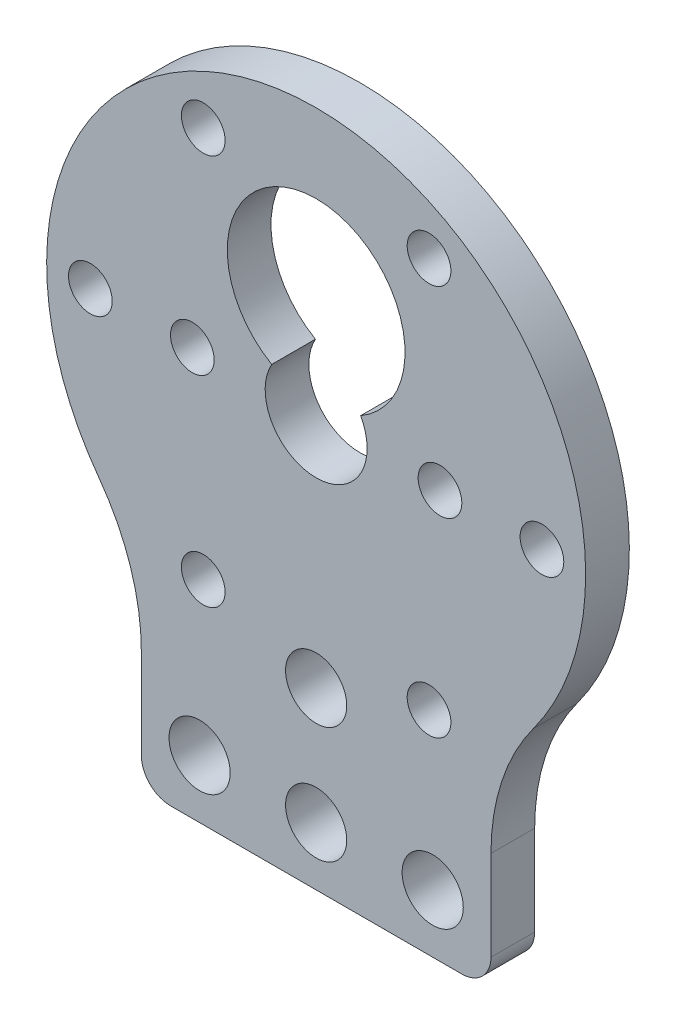
ISO-10303-21;
HEADER;
FILE_DESCRIPTION(('STEP AP214'),'2;1');
FILE_NAME('part.step','',(''),(''),'','','');
FILE_SCHEMA(('AUTOMOTIVE_DESIGN { 1 0 10303 214 1 1 1 1 }'));
ENDSEC;
DATA;
#1=APPLICATION_CONTEXT('core data for automotive mechanical design processes');
#2=APPLICATION_PROTOCOL_DEFINITION('international standard','automotive_design',2000,#1);
#3=PRODUCT_CONTEXT('',#1,'mechanical');
#4=PRODUCT('Part','Part','',(#3));
#5=PRODUCT_RELATED_PRODUCT_CATEGORY('part','',(#4));
#6=PRODUCT_DEFINITION_FORMATION('','',#4);
#7=PRODUCT_DEFINITION_CONTEXT('part definition',#1,'design');
#8=PRODUCT_DEFINITION('design','',#6,#7);
#9=PRODUCT_DEFINITION_SHAPE('','',#8);
#10=(LENGTH_UNIT() NAMED_UNIT(*) SI_UNIT(.MILLI.,.METRE.));
#11=(NAMED_UNIT(*) PLANE_ANGLE_UNIT() SI_UNIT($,.RADIAN.));
#12=(NAMED_UNIT(*) SI_UNIT($,.STERADIAN.) SOLID_ANGLE_UNIT());
#13=UNCERTAINTY_MEASURE_WITH_UNIT(LENGTH_MEASURE(1.E-05),#10,'distance_accuracy_value','');
#14=(GEOMETRIC_REPRESENTATION_CONTEXT(3) GLOBAL_UNCERTAINTY_ASSIGNED_CONTEXT((#13)) GLOBAL_UNIT_ASSIGNED_CONTEXT((#10,
#11,#12)) REPRESENTATION_CONTEXT('',''));
#15=CARTESIAN_POINT('',(0.,0.,0.));
#16=DIRECTION('',(0.,0.,1.));
#17=DIRECTION('',(1.,0.,0.));
#18=AXIS2_PLACEMENT_3D('',#15,#16,#17);
#19=CARTESIAN_POINT('',(0.,0.,3.));
#20=DIRECTION('',(0.,0.,1.));
#21=DIRECTION('',(1.,0.,0.));
#22=AXIS2_PLACEMENT_3D('',#19,#20,#21);
#23=PLANE('',#22);
#24=CARTESIAN_POINT('',(8.5,0.,3.));
#25=DIRECTION('',(0.,0.,1.));
#26=DIRECTION('',(1.,0.,0.));
#27=AXIS2_PLACEMENT_3D('',#24,#25,#26);
#28=CIRCLE('',#27,1.5);
#29=CARTESIAN_POINT('',(10.,0.,3.));
#30=VERTEX_POINT('',#29);
#31=EDGE_CURVE('E456',#30,#30,#28,.T.);
#32=ORIENTED_EDGE('',*,*,#31,.F.);
#33=EDGE_LOOP('',(#32));
#34=FACE_BOUND('',#33,.T.);
#35=CARTESIAN_POINT('',(-8.5,0.,3.));
#36=DIRECTION('',(0.,0.,1.));
#37=DIRECTION('',(1.,0.,0.));
#38=AXIS2_PLACEMENT_3D('',#35,#36,#37);
#39=CIRCLE('',#38,1.5);
#40=CARTESIAN_POINT('',(-7.,0.,3.));
#41=VERTEX_POINT('',#40);
#42=EDGE_CURVE('E450',#41,#41,#39,.T.);
#43=ORIENTED_EDGE('',*,*,#42,.F.);
#44=EDGE_LOOP('',(#43));
#45=FACE_BOUND('',#44,.T.);
#46=CARTESIAN_POINT('',(0.,-16.,3.));
#47=DIRECTION('',(0.,0.,1.));
#48=DIRECTION('',(1.,0.,0.));
#49=AXIS2_PLACEMENT_3D('',#46,#47,#48);
#50=CIRCLE('',#49,2.1);
#51=CARTESIAN_POINT('',(2.1,-16.,3.));
#52=VERTEX_POINT('',#51);
#53=EDGE_CURVE('E453',#52,#52,#50,.T.);
#54=ORIENTED_EDGE('',*,*,#53,.F.);
#55=EDGE_LOOP('',(#54));
#56=FACE_BOUND('',#55,.T.);
#57=CARTESIAN_POINT('',(0.,-24.,3.));
#58=DIRECTION('',(0.,0.,1.));
#59=DIRECTION('',(1.,0.,0.));
#60=AXIS2_PLACEMENT_3D('',#57,#58,#59);
#61=CIRCLE('',#60,2.1);
#62=CARTESIAN_POINT('',(2.1,-24.,3.));
#63=VERTEX_POINT('',#62);
#64=EDGE_CURVE('E465',#63,#63,#61,.T.);
#65=ORIENTED_EDGE('',*,*,#64,.F.);
#66=EDGE_LOOP('',(#65));
#67=FACE_BOUND('',#66,.T.);
#68=CARTESIAN_POINT('',(8.,-24.,3.));
#69=DIRECTION('',(0.,0.,1.));
#70=DIRECTION('',(1.,0.,0.));
#71=AXIS2_PLACEMENT_3D('',#68,#69,#70);
#72=CIRCLE('',#71,2.1);
#73=CARTESIAN_POINT('',(10.1,-24.,3.));
#74=VERTEX_POINT('',#73);
#75=EDGE_CURVE('E471',#74,#74,#72,.T.);
#76=ORIENTED_EDGE('',*,*,#75,.F.);
#77=EDGE_LOOP('',(#76));
#78=FACE_BOUND('',#77,.T.);
#79=CARTESIAN_POINT('',(-8.,-24.,3.));
#80=DIRECTION('',(0.,0.,1.));
#81=DIRECTION('',(1.,0.,0.));
#82=AXIS2_PLACEMENT_3D('',#79,#80,#81);
#83=CIRCLE('',#82,2.1);
#84=CARTESIAN_POINT('',(-5.9,-24.,3.));
#85=VERTEX_POINT('',#84);
#86=EDGE_CURVE('E477',#85,#85,#83,.T.);
#87=ORIENTED_EDGE('',*,*,#86,.F.);
#88=EDGE_LOOP('',(#87));
#89=FACE_BOUND('',#88,.T.);
#90=CARTESIAN_POINT('',(7.75000000000016,-13.4233937586587,3.));
#91=DIRECTION('',(0.,0.,1.));
#92=DIRECTION('',(1.,0.,0.));
#93=AXIS2_PLACEMENT_3D('',#90,#91,#92);
#94=CIRCLE('',#93,1.5);
#95=CARTESIAN_POINT('',(9.25000000000016,-13.4233937586587,3.));
#96=VERTEX_POINT('',#95);
#97=EDGE_CURVE('E483',#96,#96,#94,.T.);
#98=ORIENTED_EDGE('',*,*,#97,.F.);
#99=EDGE_LOOP('',(#98));
#100=FACE_BOUND('',#99,.T.);
#101=CARTESIAN_POINT('',(-7.74999999999987,-13.4233937586589,3.));
#102=DIRECTION('',(0.,0.,1.));
#103=DIRECTION('',(1.,0.,0.));
#104=AXIS2_PLACEMENT_3D('',#101,#102,#103);
#105=CIRCLE('',#104,1.5);
#106=CARTESIAN_POINT('',(-6.24999999999988,-13.4233937586589,3.));
#107=VERTEX_POINT('',#106);
#108=EDGE_CURVE('E489',#107,#107,#105,.T.);
#109=ORIENTED_EDGE('',*,*,#108,.F.);
#110=EDGE_LOOP('',(#109));
#111=FACE_BOUND('',#110,.T.);
#112=CARTESIAN_POINT('',(-15.5,0.,3.));
#113=DIRECTION('',(0.,0.,1.));
#114=DIRECTION('',(1.,0.,0.));
#115=AXIS2_PLACEMENT_3D('',#112,#113,#114);
#116=CIRCLE('',#115,1.5);
#117=CARTESIAN_POINT('',(-14.,0.,3.));
#118=VERTEX_POINT('',#117);
#119=EDGE_CURVE('E495',#118,#118,#116,.T.);
#120=ORIENTED_EDGE('',*,*,#119,.F.);
#121=EDGE_LOOP('',(#120));
#122=FACE_BOUND('',#121,.T.);
#123=CARTESIAN_POINT('',(-7.75000000000006,13.4233937586588,3.));
#124=DIRECTION('',(0.,0.,1.));
#125=DIRECTION('',(1.,0.,0.));
#126=AXIS2_PLACEMENT_3D('',#123,#124,#125);
#127=CIRCLE('',#126,1.5);
#128=CARTESIAN_POINT('',(-6.25000000000006,13.4233937586588,3.));
#129=VERTEX_POINT('',#128);
#130=EDGE_CURVE('E501',#129,#129,#127,.T.);
#131=ORIENTED_EDGE('',*,*,#130,.F.);
#132=EDGE_LOOP('',(#131));
#133=FACE_BOUND('',#132,.T.);
#134=CARTESIAN_POINT('',(7.74999999999997,13.4233937586588,3.));
#135=DIRECTION('',(0.,0.,1.));
#136=DIRECTION('',(1.,0.,0.));
#137=AXIS2_PLACEMENT_3D('',#134,#135,#136);
#138=CIRCLE('',#137,1.5);
#139=CARTESIAN_POINT('',(9.24999999999997,13.4233937586588,3.));
#140=VERTEX_POINT('',#139);
#141=EDGE_CURVE('E507',#140,#140,#138,.T.);
#142=ORIENTED_EDGE('',*,*,#141,.F.);
#143=EDGE_LOOP('',(#142));
#144=FACE_BOUND('',#143,.T.);
#145=CARTESIAN_POINT('',(15.5,0.,3.));
#146=DIRECTION('',(0.,0.,1.));
#147=DIRECTION('',(1.,0.,0.));
#148=AXIS2_PLACEMENT_3D('',#145,#146,#147);
#149=CIRCLE('',#148,1.5);
#150=CARTESIAN_POINT('',(17.,0.,3.));
#151=VERTEX_POINT('',#150);
#152=EDGE_CURVE('E512',#151,#151,#149,.T.);
#153=ORIENTED_EDGE('',*,*,#152,.F.);
#154=EDGE_LOOP('',(#153));
#155=FACE_BOUND('',#154,.T.);
#156=DIRECTION('',(1.,0.,0.));
#157=VECTOR('',#156,1.);
#158=CARTESIAN_POINT('',(0.,-28.,3.));
#159=LINE('',#158,#157);
#160=CARTESIAN_POINT('',(-10.,-28.,3.));
#161=VERTEX_POINT('',#160);
#162=CARTESIAN_POINT('',(10.,-28.,3.));
#163=VERTEX_POINT('',#162);
#164=EDGE_CURVE('E140',#161,#163,#159,.T.);
#165=ORIENTED_EDGE('',*,*,#164,.T.);
#166=CARTESIAN_POINT('',(10.,-26.,3.));
#167=DIRECTION('',(0.,0.,1.));
#168=DIRECTION('',(1.,0.,0.));
#169=AXIS2_PLACEMENT_3D('',#166,#167,#168);
#170=CIRCLE('',#169,2.);
#171=CARTESIAN_POINT('',(12.,-26.,3.));
#172=VERTEX_POINT('',#171);
#173=EDGE_CURVE('E42',#163,#172,#170,.T.);
#174=ORIENTED_EDGE('',*,*,#173,.T.);
#175=DIRECTION('',(0.,1.,0.));
#176=VECTOR('',#175,1.);
#177=CARTESIAN_POINT('',(12.,-28.,3.));
#178=LINE('',#177,#176);
#179=CARTESIAN_POINT('',(12.,-19.8305320150519,3.));
#180=VERTEX_POINT('',#179);
#181=EDGE_CURVE('E142',#172,#180,#178,.T.);
#182=ORIENTED_EDGE('',*,*,#181,.T.);
#183=CARTESIAN_POINT('',(27.,-19.8305320150519,3.));
#184=DIRECTION('',(0.,0.,1.));
#185=DIRECTION('',(1.,0.,0.));
#186=AXIS2_PLACEMENT_3D('',#183,#184,#185);
#187=CIRCLE('',#186,15.);
#188=CARTESIAN_POINT('',(14.910447761194,-10.9511893217451,3.));
#189=VERTEX_POINT('',#188);
#190=EDGE_CURVE('E171',#180,#189,#187,.F.);
#191=ORIENTED_EDGE('',*,*,#190,.T.);
#192=CARTESIAN_POINT('',(0.,0.,3.));
#193=DIRECTION('',(0.,0.,1.));
#194=DIRECTION('',(1.,0.,0.));
#195=AXIS2_PLACEMENT_3D('',#192,#193,#194);
#196=CIRCLE('',#195,18.5);
#197=CARTESIAN_POINT('',(-14.910447761194,-10.9511893217451,3.));
#198=VERTEX_POINT('',#197);
#199=EDGE_CURVE('E145',#189,#198,#196,.T.);
#200=ORIENTED_EDGE('',*,*,#199,.T.);
#201=CARTESIAN_POINT('',(-27.,-19.8305320150519,3.));
#202=DIRECTION('',(0.,0.,1.));
#203=DIRECTION('',(1.,0.,0.));
#204=AXIS2_PLACEMENT_3D('',#201,#202,#203);
#205=CIRCLE('',#204,15.);
#206=CARTESIAN_POINT('',(-12.,-19.8305320150519,3.));
#207=VERTEX_POINT('',#206);
#208=EDGE_CURVE('E175',#198,#207,#205,.F.);
#209=ORIENTED_EDGE('',*,*,#208,.T.);
#210=DIRECTION('',(0.,-1.,0.));
#211=VECTOR('',#210,1.);
#212=CARTESIAN_POINT('',(-12.,-28.,3.));
#213=LINE('',#212,#211);
#214=CARTESIAN_POINT('',(-12.,-26.,3.));
#215=VERTEX_POINT('',#214);
#216=EDGE_CURVE('E148',#207,#215,#213,.T.);
#217=ORIENTED_EDGE('',*,*,#216,.T.);
#218=CARTESIAN_POINT('',(-10.,-26.,3.));
#219=DIRECTION('',(0.,0.,1.));
#220=DIRECTION('',(1.,0.,0.));
#221=AXIS2_PLACEMENT_3D('',#218,#219,#220);
#222=CIRCLE('',#221,2.);
#223=EDGE_CURVE('E188',#215,#161,#222,.T.);
#224=ORIENTED_EDGE('',*,*,#223,.T.);
#225=EDGE_LOOP('',(#165,#174,#182,#191,#200,#209,#217,#224));
#226=FACE_BOUND('',#225,.T.);
#227=CARTESIAN_POINT('',(0.,0.,3.));
#228=DIRECTION('',(0.,0.,1.));
#229=DIRECTION('',(1.,0.,0.));
#230=AXIS2_PLACEMENT_3D('',#227,#228,#229);
#231=CIRCLE('',#230,3.5);
#232=CARTESIAN_POINT('',(-3.04982301259651,1.71714285714286,3.));
#233=VERTEX_POINT('',#232);
#234=CARTESIAN_POINT('',(3.04982301259651,1.71714285714286,3.));
#235=VERTEX_POINT('',#234);
#236=EDGE_CURVE('E113',#233,#235,#231,.T.);
#237=ORIENTED_EDGE('',*,*,#236,.F.);
#238=CARTESIAN_POINT('',(0.,7.,3.));
#239=DIRECTION('',(0.,0.,1.));
#240=DIRECTION('',(1.,0.,0.));
#241=AXIS2_PLACEMENT_3D('',#238,#239,#240);
#242=CIRCLE('',#241,6.1);
#243=EDGE_CURVE('E123',#235,#233,#242,.T.);
#244=ORIENTED_EDGE('',*,*,#243,.F.);
#245=EDGE_LOOP('',(#237,#244));
#246=FACE_BOUND('',#245,.T.);
#247=ADVANCED_FACE('F34',(#34,#45,#56,#67,#78,#89,#100,#111,#122,#133,#144,#155,#226,#246),#23,.T.);
#248=CARTESIAN_POINT('',(0.,0.,0.));
#249=DIRECTION('',(0.,0.,1.));
#250=DIRECTION('',(1.,0.,0.));
#251=AXIS2_PLACEMENT_3D('',#248,#249,#250);
#252=PLANE('',#251);
#253=CARTESIAN_POINT('',(8.5,0.,0.));
#254=DIRECTION('',(0.,0.,1.));
#255=DIRECTION('',(1.,0.,0.));
#256=AXIS2_PLACEMENT_3D('',#253,#254,#255);
#257=CIRCLE('',#256,1.5);
#258=CARTESIAN_POINT('',(10.,0.,0.));
#259=VERTEX_POINT('',#258);
#260=EDGE_CURVE('E451',#259,#259,#257,.T.);
#261=ORIENTED_EDGE('',*,*,#260,.T.);
#262=EDGE_LOOP('',(#261));
#263=FACE_BOUND('',#262,.T.);
#264=CARTESIAN_POINT('',(-8.5,0.,0.));
#265=DIRECTION('',(0.,0.,1.));
#266=DIRECTION('',(1.,0.,0.));
#267=AXIS2_PLACEMENT_3D('',#264,#265,#266);
#268=CIRCLE('',#267,1.5);
#269=CARTESIAN_POINT('',(-7.,0.,0.));
#270=VERTEX_POINT('',#269);
#271=EDGE_CURVE('E447',#270,#270,#268,.T.);
#272=ORIENTED_EDGE('',*,*,#271,.T.);
#273=EDGE_LOOP('',(#272));
#274=FACE_BOUND('',#273,.T.);
#275=CARTESIAN_POINT('',(0.,-16.,0.));
#276=DIRECTION('',(0.,0.,1.));
#277=DIRECTION('',(1.,0.,0.));
#278=AXIS2_PLACEMENT_3D('',#275,#276,#277);
#279=CIRCLE('',#278,2.1);
#280=CARTESIAN_POINT('',(2.1,-16.,0.));
#281=VERTEX_POINT('',#280);
#282=EDGE_CURVE('E462',#281,#281,#279,.T.);
#283=ORIENTED_EDGE('',*,*,#282,.T.);
#284=EDGE_LOOP('',(#283));
#285=FACE_BOUND('',#284,.T.);
#286=CARTESIAN_POINT('',(0.,-24.,0.));
#287=DIRECTION('',(0.,0.,1.));
#288=DIRECTION('',(1.,0.,0.));
#289=AXIS2_PLACEMENT_3D('',#286,#287,#288);
#290=CIRCLE('',#289,2.1);
#291=CARTESIAN_POINT('',(2.1,-24.,0.));
#292=VERTEX_POINT('',#291);
#293=EDGE_CURVE('E468',#292,#292,#290,.T.);
#294=ORIENTED_EDGE('',*,*,#293,.T.);
#295=EDGE_LOOP('',(#294));
#296=FACE_BOUND('',#295,.T.);
#297=CARTESIAN_POINT('',(8.,-24.,0.));
#298=DIRECTION('',(0.,0.,1.));
#299=DIRECTION('',(1.,0.,0.));
#300=AXIS2_PLACEMENT_3D('',#297,#298,#299);
#301=CIRCLE('',#300,2.1);
#302=CARTESIAN_POINT('',(10.1,-24.,0.));
#303=VERTEX_POINT('',#302);
#304=EDGE_CURVE('E474',#303,#303,#301,.T.);
#305=ORIENTED_EDGE('',*,*,#304,.T.);
#306=EDGE_LOOP('',(#305));
#307=FACE_BOUND('',#306,.T.);
#308=CARTESIAN_POINT('',(-8.,-24.,0.));
#309=DIRECTION('',(0.,0.,1.));
#310=DIRECTION('',(1.,0.,0.));
#311=AXIS2_PLACEMENT_3D('',#308,#309,#310);
#312=CIRCLE('',#311,2.1);
#313=CARTESIAN_POINT('',(-5.9,-24.,0.));
#314=VERTEX_POINT('',#313);
#315=EDGE_CURVE('E480',#314,#314,#312,.T.);
#316=ORIENTED_EDGE('',*,*,#315,.T.);
#317=EDGE_LOOP('',(#316));
#318=FACE_BOUND('',#317,.T.);
#319=CARTESIAN_POINT('',(7.75000000000016,-13.4233937586587,0.));
#320=DIRECTION('',(0.,0.,1.));
#321=DIRECTION('',(1.,0.,0.));
#322=AXIS2_PLACEMENT_3D('',#319,#320,#321);
#323=CIRCLE('',#322,1.5);
#324=CARTESIAN_POINT('',(9.25000000000016,-13.4233937586587,0.));
#325=VERTEX_POINT('',#324);
#326=EDGE_CURVE('E486',#325,#325,#323,.T.);
#327=ORIENTED_EDGE('',*,*,#326,.T.);
#328=EDGE_LOOP('',(#327));
#329=FACE_BOUND('',#328,.T.);
#330=CARTESIAN_POINT('',(-7.74999999999987,-13.4233937586589,0.));
#331=DIRECTION('',(0.,0.,1.));
#332=DIRECTION('',(1.,0.,0.));
#333=AXIS2_PLACEMENT_3D('',#330,#331,#332);
#334=CIRCLE('',#333,1.5);
#335=CARTESIAN_POINT('',(-6.24999999999988,-13.4233937586589,0.));
#336=VERTEX_POINT('',#335);
#337=EDGE_CURVE('E492',#336,#336,#334,.T.);
#338=ORIENTED_EDGE('',*,*,#337,.T.);
#339=EDGE_LOOP('',(#338));
#340=FACE_BOUND('',#339,.T.);
#341=CARTESIAN_POINT('',(-15.5,0.,0.));
#342=DIRECTION('',(0.,0.,1.));
#343=DIRECTION('',(1.,0.,0.));
#344=AXIS2_PLACEMENT_3D('',#341,#342,#343);
#345=CIRCLE('',#344,1.5);
#346=CARTESIAN_POINT('',(-14.,0.,0.));
#347=VERTEX_POINT('',#346);
#348=EDGE_CURVE('E498',#347,#347,#345,.T.);
#349=ORIENTED_EDGE('',*,*,#348,.T.);
#350=EDGE_LOOP('',(#349));
#351=FACE_BOUND('',#350,.T.);
#352=CARTESIAN_POINT('',(-7.75000000000006,13.4233937586588,0.));
#353=DIRECTION('',(0.,0.,1.));
#354=DIRECTION('',(1.,0.,0.));
#355=AXIS2_PLACEMENT_3D('',#352,#353,#354);
#356=CIRCLE('',#355,1.5);
#357=CARTESIAN_POINT('',(-6.25000000000006,13.4233937586588,0.));
#358=VERTEX_POINT('',#357);
#359=EDGE_CURVE('E504',#358,#358,#356,.T.);
#360=ORIENTED_EDGE('',*,*,#359,.T.);
#361=EDGE_LOOP('',(#360));
#362=FACE_BOUND('',#361,.T.);
#363=CARTESIAN_POINT('',(7.74999999999997,13.4233937586588,0.));
#364=DIRECTION('',(0.,0.,1.));
#365=DIRECTION('',(1.,0.,0.));
#366=AXIS2_PLACEMENT_3D('',#363,#364,#365);
#367=CIRCLE('',#366,1.5);
#368=CARTESIAN_POINT('',(9.24999999999997,13.4233937586588,0.));
#369=VERTEX_POINT('',#368);
#370=EDGE_CURVE('E510',#369,#369,#367,.T.);
#371=ORIENTED_EDGE('',*,*,#370,.T.);
#372=EDGE_LOOP('',(#371));
#373=FACE_BOUND('',#372,.T.);
#374=CARTESIAN_POINT('',(15.5,0.,0.));
#375=DIRECTION('',(0.,0.,1.));
#376=DIRECTION('',(1.,0.,0.));
#377=AXIS2_PLACEMENT_3D('',#374,#375,#376);
#378=CIRCLE('',#377,1.5);
#379=CARTESIAN_POINT('',(17.,0.,0.));
#380=VERTEX_POINT('',#379);
#381=EDGE_CURVE('E134',#380,#380,#378,.T.);
#382=ORIENTED_EDGE('',*,*,#381,.T.);
#383=EDGE_LOOP('',(#382));
#384=FACE_BOUND('',#383,.T.);
#385=DIRECTION('',(0.,1.,0.));
#386=VECTOR('',#385,1.);
#387=CARTESIAN_POINT('',(12.,-28.,0.));
#388=LINE('',#387,#386);
#389=CARTESIAN_POINT('',(12.,-26.,0.));
#390=VERTEX_POINT('',#389);
#391=CARTESIAN_POINT('',(12.,-19.8305320150519,0.));
#392=VERTEX_POINT('',#391);
#393=EDGE_CURVE('E152',#390,#392,#388,.T.);
#394=ORIENTED_EDGE('',*,*,#393,.F.);
#395=CARTESIAN_POINT('',(10.,-26.,0.));
#396=DIRECTION('',(0.,0.,1.));
#397=DIRECTION('',(1.,0.,0.));
#398=AXIS2_PLACEMENT_3D('',#395,#396,#397);
#399=CIRCLE('',#398,2.);
#400=CARTESIAN_POINT('',(10.,-28.,0.));
#401=VERTEX_POINT('',#400);
#402=EDGE_CURVE('E182',#390,#401,#399,.F.);
#403=ORIENTED_EDGE('',*,*,#402,.T.);
#404=DIRECTION('',(1.,0.,0.));
#405=VECTOR('',#404,1.);
#406=CARTESIAN_POINT('',(0.,-28.,0.));
#407=LINE('',#406,#405);
#408=CARTESIAN_POINT('',(-10.,-28.,0.));
#409=VERTEX_POINT('',#408);
#410=EDGE_CURVE('E139',#409,#401,#407,.T.);
#411=ORIENTED_EDGE('',*,*,#410,.F.);
#412=CARTESIAN_POINT('',(-10.,-26.,0.));
#413=DIRECTION('',(0.,0.,1.));
#414=DIRECTION('',(1.,0.,0.));
#415=AXIS2_PLACEMENT_3D('',#412,#413,#414);
#416=CIRCLE('',#415,2.);
#417=CARTESIAN_POINT('',(-12.,-26.,0.));
#418=VERTEX_POINT('',#417);
#419=EDGE_CURVE('E180',#409,#418,#416,.F.);
#420=ORIENTED_EDGE('',*,*,#419,.T.);
#421=DIRECTION('',(0.,-1.,0.));
#422=VECTOR('',#421,1.);
#423=CARTESIAN_POINT('',(-12.,-28.,0.));
#424=LINE('',#423,#422);
#425=CARTESIAN_POINT('',(-12.,-19.8305320150519,0.));
#426=VERTEX_POINT('',#425);
#427=EDGE_CURVE('E143',#426,#418,#424,.T.);
#428=ORIENTED_EDGE('',*,*,#427,.F.);
#429=CARTESIAN_POINT('',(-27.,-19.8305320150519,0.));
#430=DIRECTION('',(0.,0.,1.));
#431=DIRECTION('',(1.,0.,0.));
#432=AXIS2_PLACEMENT_3D('',#429,#430,#431);
#433=CIRCLE('',#432,15.);
#434=CARTESIAN_POINT('',(-14.910447761194,-10.9511893217451,0.));
#435=VERTEX_POINT('',#434);
#436=EDGE_CURVE('E173',#426,#435,#433,.T.);
#437=ORIENTED_EDGE('',*,*,#436,.T.);
#438=CARTESIAN_POINT('',(0.,0.,0.));
#439=DIRECTION('',(0.,0.,1.));
#440=DIRECTION('',(1.,0.,0.));
#441=AXIS2_PLACEMENT_3D('',#438,#439,#440);
#442=CIRCLE('',#441,18.5);
#443=CARTESIAN_POINT('',(14.910447761194,-10.9511893217451,0.));
#444=VERTEX_POINT('',#443);
#445=EDGE_CURVE('E154',#444,#435,#442,.T.);
#446=ORIENTED_EDGE('',*,*,#445,.F.);
#447=CARTESIAN_POINT('',(27.,-19.8305320150519,0.));
#448=DIRECTION('',(0.,0.,1.));
#449=DIRECTION('',(1.,0.,0.));
#450=AXIS2_PLACEMENT_3D('',#447,#448,#449);
#451=CIRCLE('',#450,15.);
#452=EDGE_CURVE('E168',#444,#392,#451,.T.);
#453=ORIENTED_EDGE('',*,*,#452,.T.);
#454=EDGE_LOOP('',(#394,#403,#411,#420,#428,#437,#446,#453));
#455=FACE_BOUND('',#454,.T.);
#456=CARTESIAN_POINT('',(0.,7.,0.));
#457=DIRECTION('',(0.,0.,1.));
#458=DIRECTION('',(1.,0.,0.));
#459=AXIS2_PLACEMENT_3D('',#456,#457,#458);
#460=CIRCLE('',#459,6.1);
#461=CARTESIAN_POINT('',(3.04982301259651,1.71714285714286,0.));
#462=VERTEX_POINT('',#461);
#463=CARTESIAN_POINT('',(-3.04982301259651,1.71714285714286,0.));
#464=VERTEX_POINT('',#463);
#465=EDGE_CURVE('E128',#462,#464,#460,.T.);
#466=ORIENTED_EDGE('',*,*,#465,.T.);
#467=CARTESIAN_POINT('',(0.,0.,0.));
#468=DIRECTION('',(0.,0.,1.));
#469=DIRECTION('',(1.,0.,0.));
#470=AXIS2_PLACEMENT_3D('',#467,#468,#469);
#471=CIRCLE('',#470,3.5);
#472=EDGE_CURVE('E130',#464,#462,#471,.T.);
#473=ORIENTED_EDGE('',*,*,#472,.T.);
#474=EDGE_LOOP('',(#466,#473));
#475=FACE_BOUND('',#474,.T.);
#476=ADVANCED_FACE('F202',(#263,#274,#285,#296,#307,#318,#329,#340,#351,#362,#373,#384,#455,
#475),#252,.F.);
#477=CARTESIAN_POINT('',(0.,-28.,3.));
#478=DIRECTION('',(0.,1.,0.));
#479=DIRECTION('',(0.,0.,1.));
#480=AXIS2_PLACEMENT_3D('',#477,#478,#479);
#481=PLANE('',#480);
#482=ORIENTED_EDGE('',*,*,#410,.T.);
#483=DIRECTION('',(0.,0.,-1.));
#484=VECTOR('',#483,1.);
#485=CARTESIAN_POINT('',(10.,-28.,3.));
#486=LINE('',#485,#484);
#487=EDGE_CURVE('E55',#401,#163,#486,.F.);
#488=ORIENTED_EDGE('',*,*,#487,.T.);
#489=ORIENTED_EDGE('',*,*,#164,.F.);
#490=DIRECTION('',(0.,0.,-1.));
#491=VECTOR('',#490,1.);
#492=CARTESIAN_POINT('',(-10.,-28.,3.));
#493=LINE('',#492,#491);
#494=EDGE_CURVE('E184',#161,#409,#493,.T.);
#495=ORIENTED_EDGE('',*,*,#494,.T.);
#496=EDGE_LOOP('',(#482,#488,#489,#495));
#497=FACE_BOUND('',#496,.T.);
#498=ADVANCED_FACE('F204',(#497),#481,.F.);
#499=CARTESIAN_POINT('',(12.,-28.,3.));
#500=DIRECTION('',(-1.,0.,0.));
#501=DIRECTION('',(0.,0.,1.));
#502=AXIS2_PLACEMENT_3D('',#499,#500,#501);
#503=PLANE('',#502);
#504=ORIENTED_EDGE('',*,*,#181,.F.);
#505=DIRECTION('',(0.,0.,-1.));
#506=VECTOR('',#505,1.);
#507=CARTESIAN_POINT('',(12.,-26.,3.));
#508=LINE('',#507,#506);
#509=EDGE_CURVE('E177',#172,#390,#508,.T.);
#510=ORIENTED_EDGE('',*,*,#509,.T.);
#511=ORIENTED_EDGE('',*,*,#393,.T.);
#512=DIRECTION('',(0.,0.,1.));
#513=VECTOR('',#512,1.);
#514=CARTESIAN_POINT('',(12.,-19.8305320150519,3.));
#515=LINE('',#514,#513);
#516=EDGE_CURVE('E162',#392,#180,#515,.T.);
#517=ORIENTED_EDGE('',*,*,#516,.T.);
#518=EDGE_LOOP('',(#504,#510,#511,#517));
#519=FACE_BOUND('',#518,.T.);
#520=ADVANCED_FACE('F195',(#519),#503,.F.);
#521=CARTESIAN_POINT('',(0.,0.,3.));
#522=DIRECTION('',(0.,0.,-1.));
#523=DIRECTION('',(-1.,0.,0.));
#524=AXIS2_PLACEMENT_3D('',#521,#522,#523);
#525=CYLINDRICAL_SURFACE('',#524,18.5);
#526=ORIENTED_EDGE('',*,*,#199,.F.);
#527=DIRECTION('',(0.,0.,-1.));
#528=VECTOR('',#527,1.);
#529=CARTESIAN_POINT('',(14.910447761194,-10.9511893217451,3.));
#530=LINE('',#529,#528);
#531=EDGE_CURVE('E159',#189,#444,#530,.T.);
#532=ORIENTED_EDGE('',*,*,#531,.T.);
#533=ORIENTED_EDGE('',*,*,#445,.T.);
#534=DIRECTION('',(0.,0.,-1.));
#535=VECTOR('',#534,1.);
#536=CARTESIAN_POINT('',(-14.910447761194,-10.9511893217451,3.));
#537=LINE('',#536,#535);
#538=EDGE_CURVE('E150',#435,#198,#537,.F.);
#539=ORIENTED_EDGE('',*,*,#538,.T.);
#540=EDGE_LOOP('',(#526,#532,#533,#539));
#541=FACE_BOUND('',#540,.T.);
#542=ADVANCED_FACE('F218',(#541),#525,.T.);
#543=CARTESIAN_POINT('',(-12.,-28.,3.));
#544=DIRECTION('',(1.,0.,0.));
#545=DIRECTION('',(0.,0.,-1.));
#546=AXIS2_PLACEMENT_3D('',#543,#544,#545);
#547=PLANE('',#546);
#548=ORIENTED_EDGE('',*,*,#427,.T.);
#549=DIRECTION('',(0.,0.,-1.));
#550=VECTOR('',#549,1.);
#551=CARTESIAN_POINT('',(-12.,-26.,3.));
#552=LINE('',#551,#550);
#553=EDGE_CURVE('E11',#418,#215,#552,.F.);
#554=ORIENTED_EDGE('',*,*,#553,.T.);
#555=ORIENTED_EDGE('',*,*,#216,.F.);
#556=DIRECTION('',(0.,0.,1.));
#557=VECTOR('',#556,1.);
#558=CARTESIAN_POINT('',(-12.,-19.8305320150519,0.));
#559=LINE('',#558,#557);
#560=EDGE_CURVE('E165',#207,#426,#559,.F.);
#561=ORIENTED_EDGE('',*,*,#560,.T.);
#562=EDGE_LOOP('',(#548,#554,#555,#561));
#563=FACE_BOUND('',#562,.T.);
#564=ADVANCED_FACE('F209',(#563),#547,.F.);
#565=CARTESIAN_POINT('',(0.,7.,3.));
#566=DIRECTION('',(0.,0.,-1.));
#567=DIRECTION('',(-1.,0.,0.));
#568=AXIS2_PLACEMENT_3D('',#565,#566,#567);
#569=CYLINDRICAL_SURFACE('',#568,6.1);
#570=ORIENTED_EDGE('',*,*,#465,.F.);
#571=DIRECTION('',(0.,0.,-1.));
#572=VECTOR('',#571,1.);
#573=CARTESIAN_POINT('',(3.04982301259651,1.71714285714286,3.));
#574=LINE('',#573,#572);
#575=EDGE_CURVE('E116',#235,#462,#574,.T.);
#576=ORIENTED_EDGE('',*,*,#575,.F.);
#577=ORIENTED_EDGE('',*,*,#243,.T.);
#578=DIRECTION('',(0.,0.,-1.));
#579=VECTOR('',#578,1.);
#580=CARTESIAN_POINT('',(-3.04982301259651,1.71714285714286,3.));
#581=LINE('',#580,#579);
#582=EDGE_CURVE('E119',#233,#464,#581,.T.);
#583=ORIENTED_EDGE('',*,*,#582,.T.);
#584=EDGE_LOOP('',(#570,#576,#577,#583));
#585=FACE_BOUND('',#584,.T.);
#586=ADVANCED_FACE('F126',(#585),#569,.F.);
#587=CARTESIAN_POINT('',(0.,0.,3.));
#588=DIRECTION('',(0.,0.,-1.));
#589=DIRECTION('',(-1.,0.,0.));
#590=AXIS2_PLACEMENT_3D('',#587,#588,#589);
#591=CYLINDRICAL_SURFACE('',#590,3.5);
#592=ORIENTED_EDGE('',*,*,#472,.F.);
#593=ORIENTED_EDGE('',*,*,#582,.F.);
#594=ORIENTED_EDGE('',*,*,#236,.T.);
#595=ORIENTED_EDGE('',*,*,#575,.T.);
#596=EDGE_LOOP('',(#592,#593,#594,#595));
#597=FACE_BOUND('',#596,.T.);
#598=ADVANCED_FACE('F115',(#597),#591,.F.);
#599=CARTESIAN_POINT('',(15.5,0.,3.));
#600=DIRECTION('',(0.,0.,1.));
#601=DIRECTION('',(1.,0.,0.));
#602=AXIS2_PLACEMENT_3D('',#599,#600,#601);
#603=CYLINDRICAL_SURFACE('',#602,1.5);
#604=ORIENTED_EDGE('',*,*,#381,.F.);
#605=EDGE_LOOP('',(#604));
#606=FACE_BOUND('',#605,.T.);
#607=ORIENTED_EDGE('',*,*,#152,.T.);
#608=EDGE_LOOP('',(#607));
#609=FACE_BOUND('',#608,.T.);
#610=ADVANCED_FACE('F282',(#606,#609),#603,.F.);
#611=CARTESIAN_POINT('',(7.74999999999997,13.4233937586588,3.));
#612=DIRECTION('',(0.,0.,1.));
#613=DIRECTION('',(1.,0.,0.));
#614=AXIS2_PLACEMENT_3D('',#611,#612,#613);
#615=CYLINDRICAL_SURFACE('',#614,1.5);
#616=ORIENTED_EDGE('',*,*,#370,.F.);
#617=EDGE_LOOP('',(#616));
#618=FACE_BOUND('',#617,.T.);
#619=ORIENTED_EDGE('',*,*,#141,.T.);
#620=EDGE_LOOP('',(#619));
#621=FACE_BOUND('',#620,.T.);
#622=ADVANCED_FACE('F288',(#618,#621),#615,.F.);
#623=CARTESIAN_POINT('',(-7.75000000000006,13.4233937586588,3.));
#624=DIRECTION('',(0.,0.,1.));
#625=DIRECTION('',(1.,0.,0.));
#626=AXIS2_PLACEMENT_3D('',#623,#624,#625);
#627=CYLINDRICAL_SURFACE('',#626,1.5);
#628=ORIENTED_EDGE('',*,*,#359,.F.);
#629=EDGE_LOOP('',(#628));
#630=FACE_BOUND('',#629,.T.);
#631=ORIENTED_EDGE('',*,*,#130,.T.);
#632=EDGE_LOOP('',(#631));
#633=FACE_BOUND('',#632,.T.);
#634=ADVANCED_FACE('F296',(#630,#633),#627,.F.);
#635=CARTESIAN_POINT('',(-15.5,0.,3.));
#636=DIRECTION('',(0.,0.,1.));
#637=DIRECTION('',(1.,0.,0.));
#638=AXIS2_PLACEMENT_3D('',#635,#636,#637);
#639=CYLINDRICAL_SURFACE('',#638,1.5);
#640=ORIENTED_EDGE('',*,*,#348,.F.);
#641=EDGE_LOOP('',(#640));
#642=FACE_BOUND('',#641,.T.);
#643=ORIENTED_EDGE('',*,*,#119,.T.);
#644=EDGE_LOOP('',(#643));
#645=FACE_BOUND('',#644,.T.);
#646=ADVANCED_FACE('F304',(#642,#645),#639,.F.);
#647=CARTESIAN_POINT('',(-7.74999999999987,-13.4233937586589,3.));
#648=DIRECTION('',(0.,0.,1.));
#649=DIRECTION('',(1.,0.,0.));
#650=AXIS2_PLACEMENT_3D('',#647,#648,#649);
#651=CYLINDRICAL_SURFACE('',#650,1.5);
#652=ORIENTED_EDGE('',*,*,#337,.F.);
#653=EDGE_LOOP('',(#652));
#654=FACE_BOUND('',#653,.T.);
#655=ORIENTED_EDGE('',*,*,#108,.T.);
#656=EDGE_LOOP('',(#655));
#657=FACE_BOUND('',#656,.T.);
#658=ADVANCED_FACE('F312',(#654,#657),#651,.F.);
#659=CARTESIAN_POINT('',(7.75000000000016,-13.4233937586587,3.));
#660=DIRECTION('',(0.,0.,1.));
#661=DIRECTION('',(1.,0.,0.));
#662=AXIS2_PLACEMENT_3D('',#659,#660,#661);
#663=CYLINDRICAL_SURFACE('',#662,1.5);
#664=ORIENTED_EDGE('',*,*,#326,.F.);
#665=EDGE_LOOP('',(#664));
#666=FACE_BOUND('',#665,.T.);
#667=ORIENTED_EDGE('',*,*,#97,.T.);
#668=EDGE_LOOP('',(#667));
#669=FACE_BOUND('',#668,.T.);
#670=ADVANCED_FACE('F320',(#666,#669),#663,.F.);
#671=CARTESIAN_POINT('',(-8.,-24.,3.));
#672=DIRECTION('',(0.,0.,1.));
#673=DIRECTION('',(1.,0.,0.));
#674=AXIS2_PLACEMENT_3D('',#671,#672,#673);
#675=CYLINDRICAL_SURFACE('',#674,2.1);
#676=ORIENTED_EDGE('',*,*,#315,.F.);
#677=EDGE_LOOP('',(#676));
#678=FACE_BOUND('',#677,.T.);
#679=ORIENTED_EDGE('',*,*,#86,.T.);
#680=EDGE_LOOP('',(#679));
#681=FACE_BOUND('',#680,.T.);
#682=ADVANCED_FACE('F328',(#678,#681),#675,.F.);
#683=CARTESIAN_POINT('',(8.,-24.,3.));
#684=DIRECTION('',(0.,0.,1.));
#685=DIRECTION('',(1.,0.,0.));
#686=AXIS2_PLACEMENT_3D('',#683,#684,#685);
#687=CYLINDRICAL_SURFACE('',#686,2.1);
#688=ORIENTED_EDGE('',*,*,#304,.F.);
#689=EDGE_LOOP('',(#688));
#690=FACE_BOUND('',#689,.T.);
#691=ORIENTED_EDGE('',*,*,#75,.T.);
#692=EDGE_LOOP('',(#691));
#693=FACE_BOUND('',#692,.T.);
#694=ADVANCED_FACE('F336',(#690,#693),#687,.F.);
#695=CARTESIAN_POINT('',(0.,-24.,3.));
#696=DIRECTION('',(0.,0.,1.));
#697=DIRECTION('',(1.,0.,0.));
#698=AXIS2_PLACEMENT_3D('',#695,#696,#697);
#699=CYLINDRICAL_SURFACE('',#698,2.1);
#700=ORIENTED_EDGE('',*,*,#293,.F.);
#701=EDGE_LOOP('',(#700));
#702=FACE_BOUND('',#701,.T.);
#703=ORIENTED_EDGE('',*,*,#64,.T.);
#704=EDGE_LOOP('',(#703));
#705=FACE_BOUND('',#704,.T.);
#706=ADVANCED_FACE('F344',(#702,#705),#699,.F.);
#707=CARTESIAN_POINT('',(0.,-16.,3.));
#708=DIRECTION('',(0.,0.,1.));
#709=DIRECTION('',(1.,0.,0.));
#710=AXIS2_PLACEMENT_3D('',#707,#708,#709);
#711=CYLINDRICAL_SURFACE('',#710,2.1);
#712=ORIENTED_EDGE('',*,*,#282,.F.);
#713=EDGE_LOOP('',(#712));
#714=FACE_BOUND('',#713,.T.);
#715=ORIENTED_EDGE('',*,*,#53,.T.);
#716=EDGE_LOOP('',(#715));
#717=FACE_BOUND('',#716,.T.);
#718=ADVANCED_FACE('F352',(#714,#717),#711,.F.);
#719=CARTESIAN_POINT('',(-8.5,0.,3.));
#720=DIRECTION('',(0.,0.,1.));
#721=DIRECTION('',(1.,0.,0.));
#722=AXIS2_PLACEMENT_3D('',#719,#720,#721);
#723=CYLINDRICAL_SURFACE('',#722,1.5);
#724=ORIENTED_EDGE('',*,*,#271,.F.);
#725=EDGE_LOOP('',(#724));
#726=FACE_BOUND('',#725,.T.);
#727=ORIENTED_EDGE('',*,*,#42,.T.);
#728=EDGE_LOOP('',(#727));
#729=FACE_BOUND('',#728,.T.);
#730=ADVANCED_FACE('F230',(#726,#729),#723,.F.);
#731=CARTESIAN_POINT('',(8.5,0.,3.));
#732=DIRECTION('',(0.,0.,1.));
#733=DIRECTION('',(1.,0.,0.));
#734=AXIS2_PLACEMENT_3D('',#731,#732,#733);
#735=CYLINDRICAL_SURFACE('',#734,1.5);
#736=ORIENTED_EDGE('',*,*,#260,.F.);
#737=EDGE_LOOP('',(#736));
#738=FACE_BOUND('',#737,.T.);
#739=ORIENTED_EDGE('',*,*,#31,.T.);
#740=EDGE_LOOP('',(#739));
#741=FACE_BOUND('',#740,.T.);
#742=ADVANCED_FACE('F223',(#738,#741),#735,.F.);
#743=CARTESIAN_POINT('',(27.,-19.8305320150519,3.));
#744=DIRECTION('',(0.,0.,-1.));
#745=DIRECTION('',(-1.,0.,0.));
#746=AXIS2_PLACEMENT_3D('',#743,#744,#745);
#747=CYLINDRICAL_SURFACE('',#746,15.);
#748=ORIENTED_EDGE('',*,*,#190,.F.);
#749=ORIENTED_EDGE('',*,*,#516,.F.);
#750=ORIENTED_EDGE('',*,*,#452,.F.);
#751=ORIENTED_EDGE('',*,*,#531,.F.);
#752=EDGE_LOOP('',(#748,#749,#750,#751));
#753=FACE_BOUND('',#752,.T.);
#754=ADVANCED_FACE('F221',(#753),#747,.F.);
#755=CARTESIAN_POINT('',(-27.,-19.8305320150519,3.));
#756=DIRECTION('',(0.,0.,-1.));
#757=DIRECTION('',(-1.,0.,0.));
#758=AXIS2_PLACEMENT_3D('',#755,#756,#757);
#759=CYLINDRICAL_SURFACE('',#758,15.);
#760=ORIENTED_EDGE('',*,*,#208,.F.);
#761=ORIENTED_EDGE('',*,*,#538,.F.);
#762=ORIENTED_EDGE('',*,*,#436,.F.);
#763=ORIENTED_EDGE('',*,*,#560,.F.);
#764=EDGE_LOOP('',(#760,#761,#762,#763));
#765=FACE_BOUND('',#764,.T.);
#766=ADVANCED_FACE('F213',(#765),#759,.F.);
#767=CARTESIAN_POINT('',(10.,-26.,3.));
#768=DIRECTION('',(0.,0.,-1.));
#769=DIRECTION('',(-1.,0.,0.));
#770=AXIS2_PLACEMENT_3D('',#767,#768,#769);
#771=CYLINDRICAL_SURFACE('',#770,2.);
#772=ORIENTED_EDGE('',*,*,#173,.F.);
#773=ORIENTED_EDGE('',*,*,#487,.F.);
#774=ORIENTED_EDGE('',*,*,#402,.F.);
#775=ORIENTED_EDGE('',*,*,#509,.F.);
#776=EDGE_LOOP('',(#772,#773,#774,#775));
#777=FACE_BOUND('',#776,.T.);
#778=ADVANCED_FACE('F199',(#777),#771,.T.);
#779=CARTESIAN_POINT('',(-10.,-26.,3.));
#780=DIRECTION('',(0.,0.,-1.));
#781=DIRECTION('',(-1.,0.,0.));
#782=AXIS2_PLACEMENT_3D('',#779,#780,#781);
#783=CYLINDRICAL_SURFACE('',#782,2.);
#784=ORIENTED_EDGE('',*,*,#223,.F.);
#785=ORIENTED_EDGE('',*,*,#553,.F.);
#786=ORIENTED_EDGE('',*,*,#419,.F.);
#787=ORIENTED_EDGE('',*,*,#494,.F.);
#788=EDGE_LOOP('',(#784,#785,#786,#787));
#789=FACE_BOUND('',#788,.T.);
#790=ADVANCED_FACE('F36',(#789),#783,.T.);
#791=CLOSED_SHELL('',(#247,#476,#498,#520,#542,#564,#586,#598,#610,#622,#634,#646,#658,#670,
#682,#694,#706,#718,#730,#742,#754,#766,#778,#790));
#792=MANIFOLD_SOLID_BREP('B2',#791);
#793=ADVANCED_BREP_SHAPE_REPRESENTATION('',(#18,#792),#14);
#794=SHAPE_DEFINITION_REPRESENTATION(#9,#793);
ENDSEC;
END-ISO-10303-21;
